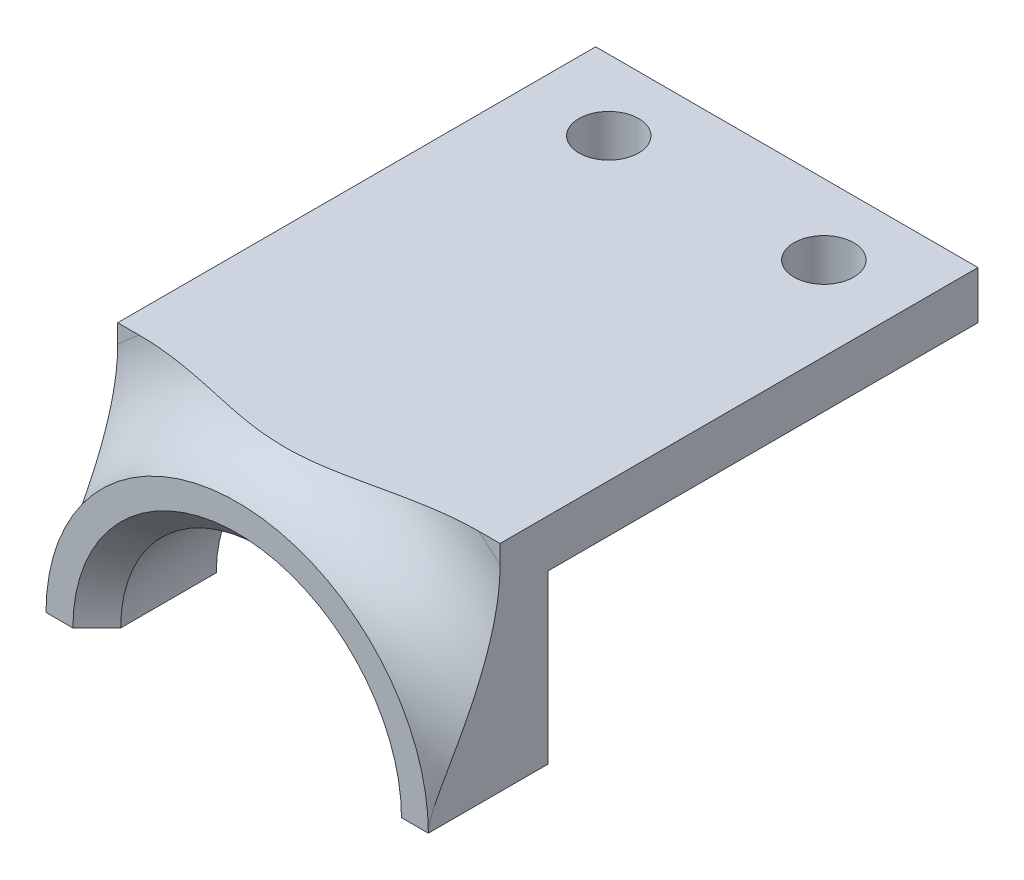
ISO-10303-21;
HEADER;
FILE_DESCRIPTION(('STEP AP214'),'2;1');
FILE_NAME('part.step','',(''),(''),'','','');
FILE_SCHEMA(('AUTOMOTIVE_DESIGN { 1 0 10303 214 1 1 1 1 }'));
ENDSEC;
DATA;
#1=APPLICATION_CONTEXT('core data for automotive mechanical design processes');
#2=APPLICATION_PROTOCOL_DEFINITION('international standard','automotive_design',2000,#1);
#3=PRODUCT_CONTEXT('',#1,'mechanical');
#4=PRODUCT('Part','Part','',(#3));
#5=PRODUCT_RELATED_PRODUCT_CATEGORY('part','',(#4));
#6=PRODUCT_DEFINITION_FORMATION('','',#4);
#7=PRODUCT_DEFINITION_CONTEXT('part definition',#1,'design');
#8=PRODUCT_DEFINITION('design','',#6,#7);
#9=PRODUCT_DEFINITION_SHAPE('','',#8);
#10=(LENGTH_UNIT() NAMED_UNIT(*) SI_UNIT(.MILLI.,.METRE.));
#11=(NAMED_UNIT(*) PLANE_ANGLE_UNIT() SI_UNIT($,.RADIAN.));
#12=(NAMED_UNIT(*) SI_UNIT($,.STERADIAN.) SOLID_ANGLE_UNIT());
#13=UNCERTAINTY_MEASURE_WITH_UNIT(LENGTH_MEASURE(1.E-05),#10,'distance_accuracy_value','');
#14=(GEOMETRIC_REPRESENTATION_CONTEXT(3) GLOBAL_UNCERTAINTY_ASSIGNED_CONTEXT((#13)) GLOBAL_UNIT_ASSIGNED_CONTEXT((#10,
#11,#12)) REPRESENTATION_CONTEXT('',''));
#15=CARTESIAN_POINT('',(0.,0.,0.));
#16=DIRECTION('',(0.,0.,1.));
#17=DIRECTION('',(1.,0.,0.));
#18=AXIS2_PLACEMENT_3D('',#15,#16,#17);
#19=CARTESIAN_POINT('',(0.,0.,4.));
#20=DIRECTION('',(0.,0.,1.));
#21=DIRECTION('',(1.,0.,0.));
#22=AXIS2_PLACEMENT_3D('',#19,#20,#21);
#23=PLANE('',#22);
#24=DIRECTION('',(0.,-1.,0.));
#25=VECTOR('',#24,1.);
#26=CARTESIAN_POINT('',(-16.,18.,4.));
#27=LINE('',#26,#25);
#28=CARTESIAN_POINT('',(-16.,18.,4.));
#29=VERTEX_POINT('',#28);
#30=CARTESIAN_POINT('',(-16.,16.4226216959661,4.));
#31=VERTEX_POINT('',#30);
#32=EDGE_CURVE('E247',#29,#31,#27,.T.);
#33=ORIENTED_EDGE('',*,*,#32,.T.);
#34=CARTESIAN_POINT('',(0.,0.,4.));
#35=DIRECTION('',(0.,0.,1.));
#36=DIRECTION('',(1.,0.,0.));
#37=AXIS2_PLACEMENT_3D('',#34,#35,#36);
#38=CIRCLE('',#37,22.9282032302755);
#39=CARTESIAN_POINT('',(-14.202200652322,18.,4.));
#40=VERTEX_POINT('',#39);
#41=EDGE_CURVE('E156',#31,#40,#38,.F.);
#42=ORIENTED_EDGE('',*,*,#41,.T.);
#43=DIRECTION('',(-1.,0.,0.));
#44=VECTOR('',#43,1.);
#45=CARTESIAN_POINT('',(-16.,18.,4.));
#46=LINE('',#45,#44);
#47=EDGE_CURVE('E235',#40,#29,#46,.T.);
#48=ORIENTED_EDGE('',*,*,#47,.T.);
#49=EDGE_LOOP('',(#33,#42,#48));
#50=FACE_BOUND('',#49,.T.);
#51=ADVANCED_FACE('F33',(#50),#23,.T.);
#52=CARTESIAN_POINT('',(0.,0.,0.));
#53=DIRECTION('',(0.,0.,1.));
#54=DIRECTION('',(1.,0.,0.));
#55=AXIS2_PLACEMENT_3D('',#52,#53,#54);
#56=PLANE('',#55);
#57=DIRECTION('',(-1.,0.,0.));
#58=VECTOR('',#57,1.);
#59=CARTESIAN_POINT('',(16.,14.,0.));
#60=LINE('',#59,#58);
#61=CARTESIAN_POINT('',(16.,14.,0.));
#62=VERTEX_POINT('',#61);
#63=CARTESIAN_POINT('',(-16.,14.,0.));
#64=VERTEX_POINT('',#63);
#65=EDGE_CURVE('E137',#62,#64,#60,.T.);
#66=ORIENTED_EDGE('',*,*,#65,.F.);
#67=DIRECTION('',(0.,1.,0.));
#68=VECTOR('',#67,1.);
#69=CARTESIAN_POINT('',(16.,18.,0.));
#70=LINE('',#69,#68);
#71=CARTESIAN_POINT('',(16.,0.,0.));
#72=VERTEX_POINT('',#71);
#73=EDGE_CURVE('E143',#72,#62,#70,.T.);
#74=ORIENTED_EDGE('',*,*,#73,.F.);
#75=DIRECTION('',(1.,0.,0.));
#76=VECTOR('',#75,1.);
#77=CARTESIAN_POINT('',(11.75,0.,0.));
#78=LINE('',#77,#76);
#79=CARTESIAN_POINT('',(11.75,0.,0.));
#80=VERTEX_POINT('',#79);
#81=EDGE_CURVE('E260',#80,#72,#78,.T.);
#82=ORIENTED_EDGE('',*,*,#81,.F.);
#83=CARTESIAN_POINT('',(0.,0.,0.));
#84=DIRECTION('',(0.,0.,-1.));
#85=DIRECTION('',(1.,0.,0.));
#86=AXIS2_PLACEMENT_3D('',#83,#84,#85);
#87=CIRCLE('',#86,11.75);
#88=CARTESIAN_POINT('',(-11.75,0.,0.));
#89=VERTEX_POINT('',#88);
#90=EDGE_CURVE('E430',#89,#80,#87,.T.);
#91=ORIENTED_EDGE('',*,*,#90,.F.);
#92=DIRECTION('',(1.,0.,0.));
#93=VECTOR('',#92,1.);
#94=CARTESIAN_POINT('',(-16.,0.,0.));
#95=LINE('',#94,#93);
#96=CARTESIAN_POINT('',(-16.,0.,0.));
#97=VERTEX_POINT('',#96);
#98=EDGE_CURVE('E146',#97,#89,#95,.T.);
#99=ORIENTED_EDGE('',*,*,#98,.F.);
#100=DIRECTION('',(0.,-1.,0.));
#101=VECTOR('',#100,1.);
#102=CARTESIAN_POINT('',(-16.,18.,0.));
#103=LINE('',#102,#101);
#104=EDGE_CURVE('E144',#64,#97,#103,.T.);
#105=ORIENTED_EDGE('',*,*,#104,.F.);
#106=EDGE_LOOP('',(#66,#74,#82,#91,#99,#105));
#107=FACE_BOUND('',#106,.T.);
#108=ADVANCED_FACE('F207',(#107),#56,.F.);
#109=CARTESIAN_POINT('',(-16.,18.,4.));
#110=DIRECTION('',(1.,0.,0.));
#111=DIRECTION('',(0.,1.,0.));
#112=AXIS2_PLACEMENT_3D('',#109,#110,#111);
#113=PLANE('',#112);
#114=DIRECTION('',(0.,0.,-1.));
#115=VECTOR('',#114,1.);
#116=CARTESIAN_POINT('',(-16.,18.,4.));
#117=LINE('',#116,#115);
#118=CARTESIAN_POINT('',(-16.,18.,-36.));
#119=VERTEX_POINT('',#118);
#120=EDGE_CURVE('E234',#29,#119,#117,.T.);
#121=ORIENTED_EDGE('',*,*,#120,.T.);
#122=DIRECTION('',(0.,1.,0.));
#123=VECTOR('',#122,1.);
#124=CARTESIAN_POINT('',(-16.,18.,-36.));
#125=LINE('',#124,#123);
#126=CARTESIAN_POINT('',(-16.,14.,-36.));
#127=VERTEX_POINT('',#126);
#128=EDGE_CURVE('E127',#127,#119,#125,.T.);
#129=ORIENTED_EDGE('',*,*,#128,.F.);
#130=DIRECTION('',(0.,0.,1.));
#131=VECTOR('',#130,1.);
#132=CARTESIAN_POINT('',(-16.,14.,-36.));
#133=LINE('',#132,#131);
#134=EDGE_CURVE('E123',#127,#64,#133,.T.);
#135=ORIENTED_EDGE('',*,*,#134,.T.);
#136=ORIENTED_EDGE('',*,*,#104,.T.);
#137=DIRECTION('',(0.,0.,-1.));
#138=VECTOR('',#137,1.);
#139=CARTESIAN_POINT('',(-16.,0.,4.));
#140=LINE('',#139,#138);
#141=CARTESIAN_POINT('',(-16.,0.,10.));
#142=VERTEX_POINT('',#141);
#143=EDGE_CURVE('E157',#142,#97,#140,.T.);
#144=ORIENTED_EDGE('',*,*,#143,.F.);
#145=CARTESIAN_POINT('',(-16.,0.,10.));
#146=CARTESIAN_POINT('',(-16.,0.0553622281529796,10.0000310459917));
#147=CARTESIAN_POINT('',(-16.,0.110700130915323,9.99800794560541));
#148=CARTESIAN_POINT('',(-16.,0.221034914777389,9.99011532670087));
#149=CARTESIAN_POINT('',(-16.,0.276032133135331,9.98425057101038));
#150=CARTESIAN_POINT('',(-16.,0.439312544249171,9.96141312698682));
#151=CARTESIAN_POINT('',(-16.,0.546870274604641,9.93918810263265));
#152=CARTESIAN_POINT('',(-16.,0.757755280280487,9.88457757992155));
#153=CARTESIAN_POINT('',(-16.,0.861118922596696,9.85232461987568));
#154=CARTESIAN_POINT('',(-16.,1.06559301942282,9.78068880805572));
#155=CARTESIAN_POINT('',(-16.,1.16669687165918,9.74128752378715));
#156=CARTESIAN_POINT('',(-16.,1.36362089882154,9.65908405030976));
#157=CARTESIAN_POINT('',(-16.,1.45950591897086,9.61643439211476));
#158=CARTESIAN_POINT('',(-16.,1.64985909115265,9.52806505770667));
#159=CARTESIAN_POINT('',(-16.,1.74432697980815,9.48234481925957));
#160=CARTESIAN_POINT('',(-16.,2.02630787554535,9.34200676634454));
#161=CARTESIAN_POINT('',(-16.,2.21225869532623,9.24427347618306));
#162=CARTESIAN_POINT('',(-16.,2.58221709119853,9.04481778918841));
#163=CARTESIAN_POINT('',(-16.,2.76622239807105,8.94309127299331));
#164=CARTESIAN_POINT('',(-16.,3.13318407516605,8.73794725158389));
#165=CARTESIAN_POINT('',(-16.,3.31614085952969,8.63453048656036));
#166=CARTESIAN_POINT('',(-16.,3.68562801600677,8.42512159108706));
#167=CARTESIAN_POINT('',(-16.,3.8721533851179,8.31912071195938));
#168=CARTESIAN_POINT('',(-16.,4.24549010288026,8.10757858890002));
#169=CARTESIAN_POINT('',(-16.,4.43230147923326,8.00203739387277));
#170=CARTESIAN_POINT('',(-16.,4.99342574137739,7.68730515054277));
#171=CARTESIAN_POINT('',(-16.,5.36871646048998,7.479839372741));
#172=CARTESIAN_POINT('',(-16.,6.0307984457983,7.12354494887337));
#173=CARTESIAN_POINT('',(-16.,6.31659206621711,6.97287252136055));
#174=CARTESIAN_POINT('',(-16.,6.8913603725466,6.67772444467067));
#175=CARTESIAN_POINT('',(-16.,7.18033510398042,6.53324888431882));
#176=CARTESIAN_POINT('',(-16.,8.0529757618694,6.11096704933796));
#177=CARTESIAN_POINT('',(-16.,8.64219581008144,5.84439480573224));
#178=CARTESIAN_POINT('',(-16.,9.83285558387159,5.3536628019372));
#179=CARTESIAN_POINT('',(-16.,10.4341646392246,5.12918932127798));
#180=CARTESIAN_POINT('',(-16.,11.6534583415026,4.73132178838445));
#181=CARTESIAN_POINT('',(-16.,12.2714304526993,4.55789044605322));
#182=CARTESIAN_POINT('',(-16.,13.1850360949798,4.35082601040635));
#183=CARTESIAN_POINT('',(-16.,13.4750935058934,4.29219734368246));
#184=CARTESIAN_POINT('',(-16.,14.0577630689725,4.18981407397259));
#185=CARTESIAN_POINT('',(-16.,14.3503743831743,4.14605476741744));
#186=CARTESIAN_POINT('',(-16.,14.9388891345735,4.07463107908559));
#187=CARTESIAN_POINT('',(-16.,15.2348013806494,4.0470380994313));
#188=CARTESIAN_POINT('',(-16.,15.8279826278194,4.00971936858076));
#189=CARTESIAN_POINT('',(-16.,16.1252525511397,4.00000846564335));
#190=CARTESIAN_POINT('',(-16.,16.4226216959661,4.));
#191=B_SPLINE_CURVE_WITH_KNOTS('',3,(#145,#146,#147,#148,#149,#150,#151,#152,#153,#154,#155,
#156,#157,#158,#159,#160,#161,#162,#163,#164,#165,#166,#167,#168,#169,#170,#171,#172,#173,#174,
#175,#176,#177,#178,#179,#180,#181,#182,#183,#184,#185,#186,#187,#188,#189,#190),.UNSPECIFIED.,
.F.,.F.,(4,2,2,2,2,2,2,2,2,2,2,2,2,2,2,2,2,2,2,2,2,2,4),(0.,0.166008010986609,0.331810596234234,
0.660483265558963,0.984984377983157,1.31033445148593,1.62508970152791,1.93990274232157,
2.56998588225138,3.20073703059723,3.8312189933908,4.47484290946684,5.1185337034712,
6.4049187463917,7.3740866076322,8.3432683561789,10.2821869892392,12.2060265843673,
14.1284571619044,15.0159137760858,15.9030894025269,16.7941544576361,17.6859590694026),.UNSPECIFIED.);
#192=EDGE_CURVE('E159',#142,#31,#191,.T.);
#193=ORIENTED_EDGE('',*,*,#192,.T.);
#194=ORIENTED_EDGE('',*,*,#32,.F.);
#195=EDGE_LOOP('',(#121,#129,#135,#136,#144,#193,#194));
#196=FACE_BOUND('',#195,.T.);
#197=ADVANCED_FACE('F171',(#196),#113,.F.);
#198=CARTESIAN_POINT('',(-16.,0.,4.));
#199=DIRECTION('',(0.,1.,0.));
#200=DIRECTION('',(0.,0.,1.));
#201=AXIS2_PLACEMENT_3D('',#198,#199,#200);
#202=PLANE('',#201);
#203=DIRECTION('',(0.,0.,-1.));
#204=VECTOR('',#203,1.);
#205=CARTESIAN_POINT('',(-11.75,0.,4.));
#206=LINE('',#205,#204);
#207=CARTESIAN_POINT('',(-11.75,0.,7.99999999999999));
#208=VERTEX_POINT('',#207);
#209=EDGE_CURVE('E268',#208,#89,#206,.T.);
#210=ORIENTED_EDGE('',*,*,#209,.F.);
#211=DIRECTION('',(-0.707106781186546,0.,0.707106781186549));
#212=VECTOR('',#211,1.);
#213=CARTESIAN_POINT('',(0.,0.,-3.75000000000005));
#214=LINE('',#213,#212);
#215=CARTESIAN_POINT('',(-13.75,0.,10.));
#216=VERTEX_POINT('',#215);
#217=EDGE_CURVE('E11',#208,#216,#214,.T.);
#218=ORIENTED_EDGE('',*,*,#217,.T.);
#219=DIRECTION('',(1.,0.,0.));
#220=VECTOR('',#219,1.);
#221=CARTESIAN_POINT('',(-16.,0.,10.));
#222=LINE('',#221,#220);
#223=EDGE_CURVE('E276',#142,#216,#222,.T.);
#224=ORIENTED_EDGE('',*,*,#223,.F.);
#225=ORIENTED_EDGE('',*,*,#143,.T.);
#226=ORIENTED_EDGE('',*,*,#98,.T.);
#227=EDGE_LOOP('',(#210,#218,#224,#225,#226));
#228=FACE_BOUND('',#227,.T.);
#229=ADVANCED_FACE('F201',(#228),#202,.F.);
#230=CARTESIAN_POINT('',(0.,0.,4.));
#231=DIRECTION('',(0.,0.,-1.));
#232=DIRECTION('',(-1.,0.,0.));
#233=AXIS2_PLACEMENT_3D('',#230,#231,#232);
#234=CYLINDRICAL_SURFACE('',#233,11.75);
#235=DIRECTION('',(0.,0.,-1.));
#236=VECTOR('',#235,1.);
#237=CARTESIAN_POINT('',(11.75,0.,4.));
#238=LINE('',#237,#236);
#239=CARTESIAN_POINT('',(11.75,0.,7.99999999999999));
#240=VERTEX_POINT('',#239);
#241=EDGE_CURVE('E267',#240,#80,#238,.T.);
#242=ORIENTED_EDGE('',*,*,#241,.F.);
#243=CARTESIAN_POINT('',(0.,0.,7.99999999999999));
#244=DIRECTION('',(0.,0.,-1.));
#245=DIRECTION('',(-1.,0.,0.));
#246=AXIS2_PLACEMENT_3D('',#243,#244,#245);
#247=CIRCLE('',#246,11.75);
#248=EDGE_CURVE('E42',#240,#208,#247,.F.);
#249=ORIENTED_EDGE('',*,*,#248,.T.);
#250=ORIENTED_EDGE('',*,*,#209,.T.);
#251=ORIENTED_EDGE('',*,*,#90,.T.);
#252=EDGE_LOOP('',(#242,#249,#250,#251));
#253=FACE_BOUND('',#252,.T.);
#254=ADVANCED_FACE('F199',(#253),#234,.F.);
#255=CARTESIAN_POINT('',(11.75,0.,4.));
#256=DIRECTION('',(0.,1.,0.));
#257=DIRECTION('',(0.,0.,1.));
#258=AXIS2_PLACEMENT_3D('',#255,#256,#257);
#259=PLANE('',#258);
#260=DIRECTION('',(1.,0.,0.));
#261=VECTOR('',#260,1.);
#262=CARTESIAN_POINT('',(11.75,0.,10.));
#263=LINE('',#262,#261);
#264=CARTESIAN_POINT('',(13.75,0.,10.));
#265=VERTEX_POINT('',#264);
#266=CARTESIAN_POINT('',(16.,0.,10.));
#267=VERTEX_POINT('',#266);
#268=EDGE_CURVE('E281',#265,#267,#263,.T.);
#269=ORIENTED_EDGE('',*,*,#268,.F.);
#270=DIRECTION('',(-0.707106781186546,0.,-0.707106781186549));
#271=VECTOR('',#270,1.);
#272=CARTESIAN_POINT('',(0.,0.,-3.75000000000005));
#273=LINE('',#272,#271);
#274=EDGE_CURVE('E57',#265,#240,#273,.T.);
#275=ORIENTED_EDGE('',*,*,#274,.T.);
#276=ORIENTED_EDGE('',*,*,#241,.T.);
#277=ORIENTED_EDGE('',*,*,#81,.T.);
#278=DIRECTION('',(0.,0.,-1.));
#279=VECTOR('',#278,1.);
#280=CARTESIAN_POINT('',(16.,0.,4.));
#281=LINE('',#280,#279);
#282=EDGE_CURVE('E245',#267,#72,#281,.T.);
#283=ORIENTED_EDGE('',*,*,#282,.F.);
#284=EDGE_LOOP('',(#269,#275,#276,#277,#283));
#285=FACE_BOUND('',#284,.T.);
#286=ADVANCED_FACE('F194',(#285),#259,.F.);
#287=CARTESIAN_POINT('',(16.,18.,4.));
#288=DIRECTION('',(-1.,0.,0.));
#289=DIRECTION('',(0.,-1.,0.));
#290=AXIS2_PLACEMENT_3D('',#287,#288,#289);
#291=PLANE('',#290);
#292=ORIENTED_EDGE('',*,*,#73,.T.);
#293=DIRECTION('',(0.,0.,1.));
#294=VECTOR('',#293,1.);
#295=CARTESIAN_POINT('',(16.,14.,-36.));
#296=LINE('',#295,#294);
#297=CARTESIAN_POINT('',(16.,14.,-36.));
#298=VERTEX_POINT('',#297);
#299=EDGE_CURVE('E121',#298,#62,#296,.T.);
#300=ORIENTED_EDGE('',*,*,#299,.F.);
#301=DIRECTION('',(0.,-1.,0.));
#302=VECTOR('',#301,1.);
#303=CARTESIAN_POINT('',(16.,18.,-36.));
#304=LINE('',#303,#302);
#305=CARTESIAN_POINT('',(16.,18.,-36.));
#306=VERTEX_POINT('',#305);
#307=EDGE_CURVE('E128',#306,#298,#304,.T.);
#308=ORIENTED_EDGE('',*,*,#307,.F.);
#309=DIRECTION('',(0.,0.,-1.));
#310=VECTOR('',#309,1.);
#311=CARTESIAN_POINT('',(16.,18.,4.));
#312=LINE('',#311,#310);
#313=CARTESIAN_POINT('',(16.,18.,4.));
#314=VERTEX_POINT('',#313);
#315=EDGE_CURVE('E246',#314,#306,#312,.T.);
#316=ORIENTED_EDGE('',*,*,#315,.F.);
#317=DIRECTION('',(0.,1.,0.));
#318=VECTOR('',#317,1.);
#319=CARTESIAN_POINT('',(16.,18.,4.));
#320=LINE('',#319,#318);
#321=CARTESIAN_POINT('',(16.,16.4226216959661,4.));
#322=VERTEX_POINT('',#321);
#323=EDGE_CURVE('E232',#322,#314,#320,.T.);
#324=ORIENTED_EDGE('',*,*,#323,.F.);
#325=CARTESIAN_POINT('',(16.,16.4226216959661,4.));
#326=CARTESIAN_POINT('',(16.,15.972318627979,4.00005084246164));
#327=CARTESIAN_POINT('',(16.,15.5224920185437,4.0222756279414));
#328=CARTESIAN_POINT('',(16.,14.6273702876694,4.10593357074847));
#329=CARTESIAN_POINT('',(16.,14.1820677053542,4.16728535133777));
#330=CARTESIAN_POINT('',(16.,13.301150480518,4.32348526481642));
#331=CARTESIAN_POINT('',(16.,12.8654872551729,4.41806701316074));
#332=CARTESIAN_POINT('',(16.,12.0013412219871,4.63638960253653));
#333=CARTESIAN_POINT('',(16.,11.5728627330239,4.76014735304386));
#334=CARTESIAN_POINT('',(16.,10.6620781493104,5.05251608313699));
#335=CARTESIAN_POINT('',(16.,10.1810359812369,5.2250363029459));
#336=CARTESIAN_POINT('',(16.,9.22968637073438,5.59712116039301));
#337=CARTESIAN_POINT('',(16.,8.75937823597977,5.79668404803609));
#338=CARTESIAN_POINT('',(16.,7.82823496888035,6.21777861608226));
#339=CARTESIAN_POINT('',(16.,7.36740950516637,6.43933149595417));
#340=CARTESIAN_POINT('',(16.,6.45427172696598,6.89914286263428));
#341=CARTESIAN_POINT('',(16.,6.00195902753077,7.13740059173265));
#342=CARTESIAN_POINT('',(16.,5.24198807748841,7.54996897333442));
#343=CARTESIAN_POINT('',(16.,4.9327222187588,7.72134989815197));
#344=CARTESIAN_POINT('',(16.,4.31591275733132,8.06732299685515));
#345=CARTESIAN_POINT('',(16.,4.00836953312824,8.24191584293712));
#346=CARTESIAN_POINT('',(16.,3.54627954784582,8.50411402831065));
#347=CARTESIAN_POINT('',(16.,3.39175966534317,8.59176936970503));
#348=CARTESIAN_POINT('',(16.,3.0823223022524,8.76637413322205));
#349=CARTESIAN_POINT('',(16.,2.92740482782227,8.85332356619213));
#350=CARTESIAN_POINT('',(16.,2.61674313609685,9.02550100618492));
#351=CARTESIAN_POINT('',(16.,2.46099951181701,9.11073008000598));
#352=CARTESIAN_POINT('',(16.,2.14776861595555,9.27799820135375));
#353=CARTESIAN_POINT('',(16.,1.99028122125759,9.3600370217683));
#354=CARTESIAN_POINT('',(16.,1.72508422874764,9.491852028997));
#355=CARTESIAN_POINT('',(16.,1.61820988560279,9.54329571223581));
#356=CARTESIAN_POINT('',(16.,1.40258278811262,9.64204278367908));
#357=CARTESIAN_POINT('',(16.,1.29383070763085,9.68934762167622));
#358=CARTESIAN_POINT('',(16.,1.07486994015342,9.77716880643829));
#359=CARTESIAN_POINT('',(16.,0.964687773904827,9.81775002493451));
#360=CARTESIAN_POINT('',(16.,0.741319767761234,9.88936805088318));
#361=CARTESIAN_POINT('',(16.,0.628139009036155,9.92042000650167));
#362=CARTESIAN_POINT('',(16.,0.429501126004438,9.96214381924249));
#363=CARTESIAN_POINT('',(16.,0.344744438697294,9.97604741178528));
#364=CARTESIAN_POINT('',(16.,0.173382763608767,9.99510625969413));
#365=CARTESIAN_POINT('',(16.,0.086767720283217,10.0001689750205));
#366=CARTESIAN_POINT('',(16.,0.,9.9999999999997));
#367=B_SPLINE_CURVE_WITH_KNOTS('',3,(#325,#326,#327,#328,#329,#330,#331,#332,#333,#334,#335,
#336,#337,#338,#339,#340,#341,#342,#343,#344,#345,#346,#347,#348,#349,#350,#351,#352,#353,#354,
#355,#356,#357,#358,#359,#360,#361,#362,#363,#364,#365,#366),.UNSPECIFIED.,.F.,.F.,(4,2,2,2,2,2,
2,2,2,2,2,2,2,2,2,2,2,2,2,2,4),(0.,1.34968021848336,2.6965624717116,4.03288508524903,
5.36998410085083,6.90209888061763,8.43411456091216,9.9676217986995,11.501059523573,
12.5617665179728,13.6226980828555,14.1556515762013,14.6885968642758,15.221200835589,
15.7538426534927,16.109622188652,16.4652765949225,16.817269666729,17.1687002601293,
17.4259338411971,17.6858441748383),.UNSPECIFIED.);
#368=EDGE_CURVE('E181',#322,#267,#367,.T.);
#369=ORIENTED_EDGE('',*,*,#368,.T.);
#370=ORIENTED_EDGE('',*,*,#282,.T.);
#371=EDGE_LOOP('',(#292,#300,#308,#316,#324,#369,#370));
#372=FACE_BOUND('',#371,.T.);
#373=ADVANCED_FACE('F140',(#372),#291,.F.);
#374=CARTESIAN_POINT('',(-16.,18.,4.));
#375=DIRECTION('',(0.,-1.,0.));
#376=DIRECTION('',(0.,0.,-1.));
#377=AXIS2_PLACEMENT_3D('',#374,#375,#376);
#378=PLANE('',#377);
#379=CARTESIAN_POINT('',(-8.99999999999999,18.,-30.1));
#380=DIRECTION('',(0.,1.,0.));
#381=DIRECTION('',(0.,0.,1.));
#382=AXIS2_PLACEMENT_3D('',#379,#380,#381);
#383=CIRCLE('',#382,2.5);
#384=CARTESIAN_POINT('',(-8.99999999999999,18.,-27.6));
#385=VERTEX_POINT('',#384);
#386=EDGE_CURVE('E295',#385,#385,#383,.T.);
#387=ORIENTED_EDGE('',*,*,#386,.F.);
#388=EDGE_LOOP('',(#387));
#389=FACE_BOUND('',#388,.T.);
#390=CARTESIAN_POINT('',(9.00000000000001,18.,-30.1));
#391=DIRECTION('',(0.,1.,0.));
#392=DIRECTION('',(0.,0.,1.));
#393=AXIS2_PLACEMENT_3D('',#390,#391,#392);
#394=CIRCLE('',#393,2.5);
#395=CARTESIAN_POINT('',(9.00000000000001,18.,-27.6));
#396=VERTEX_POINT('',#395);
#397=EDGE_CURVE('E292',#396,#396,#394,.T.);
#398=ORIENTED_EDGE('',*,*,#397,.F.);
#399=EDGE_LOOP('',(#398));
#400=FACE_BOUND('',#399,.T.);
#401=ORIENTED_EDGE('',*,*,#315,.T.);
#402=DIRECTION('',(1.,0.,0.));
#403=VECTOR('',#402,1.);
#404=CARTESIAN_POINT('',(16.,18.,-36.));
#405=LINE('',#404,#403);
#406=EDGE_CURVE('E134',#119,#306,#405,.T.);
#407=ORIENTED_EDGE('',*,*,#406,.F.);
#408=ORIENTED_EDGE('',*,*,#120,.F.);
#409=ORIENTED_EDGE('',*,*,#47,.F.);
#410=CARTESIAN_POINT('',(-14.202200652322,18.,4.));
#411=CARTESIAN_POINT('',(-13.7449204220987,18.,4.00002643872892));
#412=CARTESIAN_POINT('',(-13.288052827939,18.,4.01717594274318));
#413=CARTESIAN_POINT('',(-12.3768802664194,18.,4.07974974178762));
#414=CARTESIAN_POINT('',(-11.9225724981612,18.,4.12513194289899));
#415=CARTESIAN_POINT('',(-11.0152111010135,18.,4.23844485418148));
#416=CARTESIAN_POINT('',(-10.5621683698678,18.,4.3064585550452));
#417=CARTESIAN_POINT('',(-9.65874659793244,18.,4.45910576250713));
#418=CARTESIAN_POINT('',(-9.20836882516627,18.,4.54374661346638));
#419=CARTESIAN_POINT('',(-8.31057480065807,18.,4.72332231070481));
#420=CARTESIAN_POINT('',(-7.86315465926659,18.,4.81823820945634));
#421=CARTESIAN_POINT('',(-6.96911919516141,18.,5.01191481924734));
#422=CARTESIAN_POINT('',(-6.52250395610955,18.,5.11067590827795));
#423=CARTESIAN_POINT('',(-5.62856164435693,18.,5.30467225074965));
#424=CARTESIAN_POINT('',(-5.1812346813539,18.,5.39990800124851));
#425=CARTESIAN_POINT('',(-4.28410897385084,18.,5.57857657198983));
#426=CARTESIAN_POINT('',(-3.83431016285884,18.,5.66200907309787));
#427=CARTESIAN_POINT('',(-3.15675573105435,18.,5.77166101380619));
#428=CARTESIAN_POINT('',(-2.93026773688826,18.,5.80564731784882));
#429=CARTESIAN_POINT('',(-2.4764448695834,18.,5.86734134986215));
#430=CARTESIAN_POINT('',(-2.24911005840423,18.,5.89504952836017));
#431=CARTESIAN_POINT('',(-1.7937221309048,18.,5.94321023676782));
#432=CARTESIAN_POINT('',(-1.56566921081019,18.,5.96366460008746));
#433=CARTESIAN_POINT('',(-1.10898014230366,18.,5.99654806028936));
#434=CARTESIAN_POINT('',(-0.880343999343999,18.,6.00897723192107));
#435=CARTESIAN_POINT('',(-0.423126208282623,18.,6.02529550447502));
#436=CARTESIAN_POINT('',(-0.194545048827947,18.,6.02919811824721));
#437=CARTESIAN_POINT('',(0.262600728605714,18.,6.02834143378972));
#438=CARTESIAN_POINT('',(0.491165346589956,18.,6.02358213832571));
#439=CARTESIAN_POINT('',(0.947995721699764,18.,6.00559712566469));
#440=CARTESIAN_POINT('',(1.17626142158351,18.,5.992369973137));
#441=CARTESIAN_POINT('',(1.63218863884605,18.,5.95797861652223));
#442=CARTESIAN_POINT('',(1.85985014913648,18.,5.93681431972728));
#443=CARTESIAN_POINT('',(2.33381508478247,18.,5.8852312788987));
#444=CARTESIAN_POINT('',(2.58004857616026,18.,5.8541761195283));
#445=CARTESIAN_POINT('',(3.07151606719872,18.,5.78491205219572));
#446=CARTESIAN_POINT('',(3.3167499745806,18.,5.74670249838773));
#447=CARTESIAN_POINT('',(4.05102050759051,18.,5.62343480310028));
#448=CARTESIAN_POINT('',(4.53858956405897,18.,5.52974198923163));
#449=CARTESIAN_POINT('',(5.51290526151923,18.,5.33033227830732));
#450=CARTESIAN_POINT('',(5.99964312327668,18.,5.22457463819984));
#451=CARTESIAN_POINT('',(6.97284536731789,18.,5.01168988963989));
#452=CARTESIAN_POINT('',(7.45930973307614,18.,4.90456270613772));
#453=CARTESIAN_POINT('',(8.46128790619486,18.,4.69225347547573));
#454=CARTESIAN_POINT('',(8.97689957897176,18.,4.587518141115));
#455=CARTESIAN_POINT('',(10.0112690104426,18.,4.39637097418697));
#456=CARTESIAN_POINT('',(10.5300246329475,18.,4.309947881825));
#457=CARTESIAN_POINT('',(11.57221367141,18.,4.16427914031377));
#458=CARTESIAN_POINT('',(12.0956519736481,18.,4.10506638772933));
#459=CARTESIAN_POINT('',(13.1465520277825,18.,4.02290322040823));
#460=CARTESIAN_POINT('',(13.6740204896892,18.,4.00004186610694));
#461=CARTESIAN_POINT('',(14.202200652322,18.,4.));
#462=B_SPLINE_CURVE_WITH_KNOTS('',3,(#410,#411,#412,#413,#414,#415,#416,#417,#418,#419,#420,
#421,#422,#423,#424,#425,#426,#427,#428,#429,#430,#431,#432,#433,#434,#435,#436,#437,#438,#439,
#440,#441,#442,#443,#444,#445,#446,#447,#448,#449,#450,#451,#452,#453,#454,#455,#456,#457,#458,
#459,#460,#461),.UNSPECIFIED.,.F.,.F.,(4,2,2,2,2,2,2,2,2,2,2,2,2,2,2,2,2,2,2,2,2,2,2,2,2,4),(0.,
1.37093085734725,2.7398225895329,4.11379046763959,5.48836660983832,6.86044982830469,
8.23266826798461,9.60469248796921,10.9767537974418,11.6637525821887,12.3507020512899,
13.0374777691794,13.7242470901068,14.4099272302704,15.095607151503,15.7814033286073,
16.4672075162348,17.2116329212396,17.9561255598909,19.4452206244719,20.9395021789668,
22.4338659727183,24.01211053111,25.5893818273781,27.1685550174542,28.7515912320397),.UNSPECIFIED.);
#463=CARTESIAN_POINT('',(14.202200652322,18.,4.));
#464=VERTEX_POINT('',#463);
#465=EDGE_CURVE('E165',#40,#464,#462,.T.);
#466=ORIENTED_EDGE('',*,*,#465,.T.);
#467=EDGE_CURVE('E229',#314,#464,#46,.T.);
#468=ORIENTED_EDGE('',*,*,#467,.F.);
#469=EDGE_LOOP('',(#401,#407,#408,#409,#466,#468));
#470=FACE_BOUND('',#469,.T.);
#471=ADVANCED_FACE('F193',(#389,#400,#470),#378,.F.);
#472=ORIENTED_EDGE('',*,*,#467,.T.);
#473=CARTESIAN_POINT('',(0.,0.,4.));
#474=DIRECTION('',(0.,0.,1.));
#475=DIRECTION('',(1.,0.,0.));
#476=AXIS2_PLACEMENT_3D('',#473,#474,#475);
#477=CIRCLE('',#476,22.9282032302755);
#478=EDGE_CURVE('E154',#464,#322,#477,.F.);
#479=ORIENTED_EDGE('',*,*,#478,.T.);
#480=ORIENTED_EDGE('',*,*,#323,.T.);
#481=EDGE_LOOP('',(#472,#479,#480));
#482=FACE_BOUND('',#481,.T.);
#483=ADVANCED_FACE('F212',(#482),#23,.T.);
#484=CARTESIAN_POINT('',(16.,14.,-36.));
#485=DIRECTION('',(0.,1.,0.));
#486=DIRECTION('',(0.,0.,1.));
#487=AXIS2_PLACEMENT_3D('',#484,#485,#486);
#488=PLANE('',#487);
#489=CARTESIAN_POINT('',(-8.99999999999999,14.,-30.1));
#490=DIRECTION('',(0.,1.,0.));
#491=DIRECTION('',(0.,0.,1.));
#492=AXIS2_PLACEMENT_3D('',#489,#490,#491);
#493=CIRCLE('',#492,2.5);
#494=CARTESIAN_POINT('',(-8.99999999999999,14.,-27.6));
#495=VERTEX_POINT('',#494);
#496=EDGE_CURVE('E37',#495,#495,#493,.T.);
#497=ORIENTED_EDGE('',*,*,#496,.T.);
#498=EDGE_LOOP('',(#497));
#499=FACE_BOUND('',#498,.T.);
#500=CARTESIAN_POINT('',(9.00000000000001,14.,-30.1));
#501=DIRECTION('',(0.,1.,0.));
#502=DIRECTION('',(0.,0.,1.));
#503=AXIS2_PLACEMENT_3D('',#500,#501,#502);
#504=CIRCLE('',#503,2.5);
#505=CARTESIAN_POINT('',(9.00000000000001,14.,-27.6));
#506=VERTEX_POINT('',#505);
#507=EDGE_CURVE('E284',#506,#506,#504,.T.);
#508=ORIENTED_EDGE('',*,*,#507,.T.);
#509=EDGE_LOOP('',(#508));
#510=FACE_BOUND('',#509,.T.);
#511=ORIENTED_EDGE('',*,*,#65,.T.);
#512=ORIENTED_EDGE('',*,*,#134,.F.);
#513=DIRECTION('',(-1.,0.,0.));
#514=VECTOR('',#513,1.);
#515=CARTESIAN_POINT('',(16.,14.,-36.));
#516=LINE('',#515,#514);
#517=EDGE_CURVE('E116',#298,#127,#516,.T.);
#518=ORIENTED_EDGE('',*,*,#517,.F.);
#519=ORIENTED_EDGE('',*,*,#299,.T.);
#520=EDGE_LOOP('',(#511,#512,#518,#519));
#521=FACE_BOUND('',#520,.T.);
#522=ADVANCED_FACE('F119',(#499,#510,#521),#488,.F.);
#523=CARTESIAN_POINT('',(0.,0.,-36.));
#524=DIRECTION('',(0.,0.,-1.));
#525=DIRECTION('',(-1.,0.,0.));
#526=AXIS2_PLACEMENT_3D('',#523,#524,#525);
#527=PLANE('',#526);
#528=ORIENTED_EDGE('',*,*,#307,.T.);
#529=ORIENTED_EDGE('',*,*,#517,.T.);
#530=ORIENTED_EDGE('',*,*,#128,.T.);
#531=ORIENTED_EDGE('',*,*,#406,.T.);
#532=EDGE_LOOP('',(#528,#529,#530,#531));
#533=FACE_BOUND('',#532,.T.);
#534=ADVANCED_FACE('F132',(#533),#527,.T.);
#535=CARTESIAN_POINT('',(0.,0.,10.));
#536=DIRECTION('',(0.,0.,-1.));
#537=DIRECTION('',(-1.,0.,0.));
#538=AXIS2_PLACEMENT_3D('',#535,#536,#537);
#539=PLANE('',#538);
#540=ORIENTED_EDGE('',*,*,#223,.T.);
#541=CARTESIAN_POINT('',(0.,0.,10.));
#542=DIRECTION('',(0.,0.,-1.));
#543=DIRECTION('',(-1.,0.,0.));
#544=AXIS2_PLACEMENT_3D('',#541,#542,#543);
#545=CIRCLE('',#544,13.75);
#546=EDGE_CURVE('E188',#216,#265,#545,.T.);
#547=ORIENTED_EDGE('',*,*,#546,.T.);
#548=ORIENTED_EDGE('',*,*,#268,.T.);
#549=CARTESIAN_POINT('',(0.,0.,10.));
#550=DIRECTION('',(0.,0.,1.));
#551=DIRECTION('',(-1.,0.,0.));
#552=AXIS2_PLACEMENT_3D('',#549,#550,#551);
#553=CIRCLE('',#552,16.);
#554=EDGE_CURVE('E243',#267,#142,#553,.T.);
#555=ORIENTED_EDGE('',*,*,#554,.T.);
#556=EDGE_LOOP('',(#540,#547,#548,#555));
#557=FACE_BOUND('',#556,.T.);
#558=ADVANCED_FACE('F177',(#557),#539,.F.);
#559=CARTESIAN_POINT('',(0.,0.,11.));
#560=DIRECTION('',(0.,0.,1.));
#561=DIRECTION('',(1.,0.,0.));
#562=AXIS2_PLACEMENT_3D('',#559,#560,#561);
#563=TOROIDAL_SURFACE('',#562,22.9282032302755,7.);
#564=ORIENTED_EDGE('',*,*,#465,.F.);
#565=ORIENTED_EDGE('',*,*,#41,.F.);
#566=ORIENTED_EDGE('',*,*,#192,.F.);
#567=ORIENTED_EDGE('',*,*,#554,.F.);
#568=ORIENTED_EDGE('',*,*,#368,.F.);
#569=ORIENTED_EDGE('',*,*,#478,.F.);
#570=EDGE_LOOP('',(#564,#565,#566,#567,#568,#569));
#571=FACE_BOUND('',#570,.T.);
#572=ADVANCED_FACE('F174',(#571),#563,.F.);
#573=CARTESIAN_POINT('',(0.,0.,10.));
#574=DIRECTION('',(0.,0.,1.));
#575=DIRECTION('',(1.,0.,0.));
#576=AXIS2_PLACEMENT_3D('',#573,#574,#575);
#577=CONICAL_SURFACE('',#576,13.75,0.785398163397447);
#578=ORIENTED_EDGE('',*,*,#217,.F.);
#579=ORIENTED_EDGE('',*,*,#248,.F.);
#580=ORIENTED_EDGE('',*,*,#274,.F.);
#581=ORIENTED_EDGE('',*,*,#546,.F.);
#582=EDGE_LOOP('',(#578,#579,#580,#581));
#583=FACE_BOUND('',#582,.T.);
#584=ADVANCED_FACE('F35',(#583),#577,.F.);
#585=CARTESIAN_POINT('',(9.00000000000001,8.,-30.1));
#586=DIRECTION('',(0.,1.,0.));
#587=DIRECTION('',(0.,0.,1.));
#588=AXIS2_PLACEMENT_3D('',#585,#586,#587);
#589=CYLINDRICAL_SURFACE('',#588,2.5);
#590=ORIENTED_EDGE('',*,*,#397,.T.);
#591=EDGE_LOOP('',(#590));
#592=FACE_BOUND('',#591,.T.);
#593=ORIENTED_EDGE('',*,*,#507,.F.);
#594=EDGE_LOOP('',(#593));
#595=FACE_BOUND('',#594,.T.);
#596=ADVANCED_FACE('F305',(#592,#595),#589,.F.);
#597=CARTESIAN_POINT('',(-8.99999999999999,8.,-30.1));
#598=DIRECTION('',(0.,1.,0.));
#599=DIRECTION('',(0.,0.,1.));
#600=AXIS2_PLACEMENT_3D('',#597,#598,#599);
#601=CYLINDRICAL_SURFACE('',#600,2.5);
#602=ORIENTED_EDGE('',*,*,#386,.T.);
#603=EDGE_LOOP('',(#602));
#604=FACE_BOUND('',#603,.T.);
#605=ORIENTED_EDGE('',*,*,#496,.F.);
#606=EDGE_LOOP('',(#605));
#607=FACE_BOUND('',#606,.T.);
#608=ADVANCED_FACE('F303',(#604,#607),#601,.F.);
#609=CLOSED_SHELL('',(#51,#108,#197,#229,#254,#286,#373,#471,#483,#522,#534,#558,#572,#584,#596,#608));
#610=MANIFOLD_SOLID_BREP('B2',#609);
#611=ADVANCED_BREP_SHAPE_REPRESENTATION('',(#18,#610),#14);
#612=SHAPE_DEFINITION_REPRESENTATION(#9,#611);
ENDSEC;
END-ISO-10303-21;
